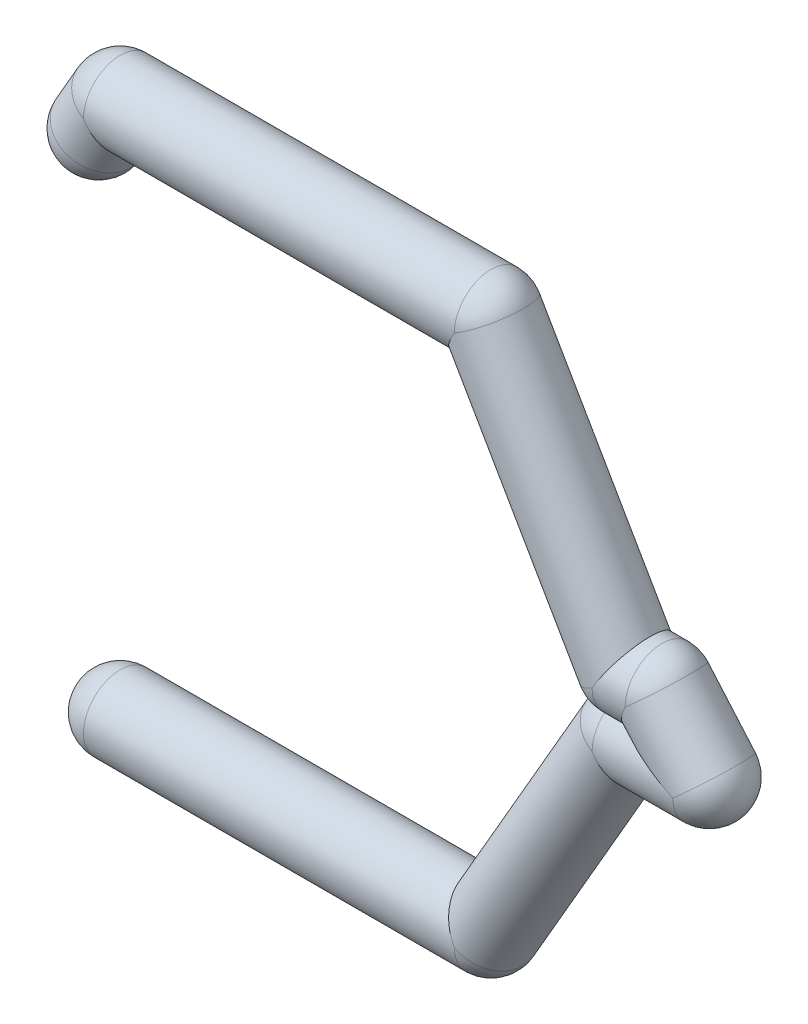
ISO-10303-21;
HEADER;
FILE_DESCRIPTION(('STEP AP214'),'2;1');
FILE_NAME('part.step','',(''),(''),'','','');
FILE_SCHEMA(('AUTOMOTIVE_DESIGN { 1 0 10303 214 1 1 1 1 }'));
ENDSEC;
DATA;
#1=APPLICATION_CONTEXT('core data for automotive mechanical design processes');
#2=APPLICATION_PROTOCOL_DEFINITION('international standard','automotive_design',2000,#1);
#3=PRODUCT_CONTEXT('',#1,'mechanical');
#4=PRODUCT('Part','Part','',(#3));
#5=PRODUCT_RELATED_PRODUCT_CATEGORY('part','',(#4));
#6=PRODUCT_DEFINITION_FORMATION('','',#4);
#7=PRODUCT_DEFINITION_CONTEXT('part definition',#1,'design');
#8=PRODUCT_DEFINITION('design','',#6,#7);
#9=PRODUCT_DEFINITION_SHAPE('','',#8);
#10=(LENGTH_UNIT() NAMED_UNIT(*) SI_UNIT(.MILLI.,.METRE.));
#11=(NAMED_UNIT(*) PLANE_ANGLE_UNIT() SI_UNIT($,.RADIAN.));
#12=(NAMED_UNIT(*) SI_UNIT($,.STERADIAN.) SOLID_ANGLE_UNIT());
#13=UNCERTAINTY_MEASURE_WITH_UNIT(LENGTH_MEASURE(1.E-05),#10,'distance_accuracy_value','');
#14=(GEOMETRIC_REPRESENTATION_CONTEXT(3) GLOBAL_UNCERTAINTY_ASSIGNED_CONTEXT((#13)) GLOBAL_UNIT_ASSIGNED_CONTEXT((#10,
#11,#12)) REPRESENTATION_CONTEXT('',''));
#15=CARTESIAN_POINT('',(0.,0.,0.));
#16=DIRECTION('',(0.,0.,1.));
#17=DIRECTION('',(1.,0.,0.));
#18=AXIS2_PLACEMENT_3D('',#15,#16,#17);
#19=CARTESIAN_POINT('',(-14.515,-1.92,0.825));
#20=DIRECTION('',(1.,0.,0.));
#21=DIRECTION('',(0.,-1.,0.));
#22=AXIS2_PLACEMENT_3D('',#19,#20,#21);
#23=SPHERICAL_SURFACE('',#22,0.24);
#24=CARTESIAN_POINT('',(-14.515,-1.92,0.825));
#25=DIRECTION('',(-1.,0.,0.));
#26=DIRECTION('',(0.,0.,1.));
#27=AXIS2_PLACEMENT_3D('',#24,#25,#26);
#28=CIRCLE('',#27,0.24);
#29=CARTESIAN_POINT('',(-14.515,-1.92,0.585));
#30=VERTEX_POINT('',#29);
#31=CARTESIAN_POINT('',(-14.515,-1.92,1.065));
#32=VERTEX_POINT('',#31);
#33=EDGE_CURVE('E147',#30,#32,#28,.F.);
#34=ORIENTED_EDGE('',*,*,#33,.F.);
#35=CARTESIAN_POINT('',(-14.515,-1.92,0.825));
#36=DIRECTION('',(-0.499207881238382,-0.866482251006612,0.));
#37=DIRECTION('',(0.866482251006612,-0.499207881238382,0.));
#38=AXIS2_PLACEMENT_3D('',#35,#36,#37);
#39=CIRCLE('',#38,0.239999999999999);
#40=EDGE_CURVE('E154',#32,#30,#39,.T.);
#41=ORIENTED_EDGE('',*,*,#40,.F.);
#42=EDGE_LOOP('',(#34,#41));
#43=FACE_BOUND('',#42,.T.);
#44=ADVANCED_FACE('F81',(#43),#23,.T.);
#45=CARTESIAN_POINT('',(-12.09,-1.92,0.825));
#46=DIRECTION('',(-1.,0.,0.));
#47=DIRECTION('',(0.,0.,1.));
#48=AXIS2_PLACEMENT_3D('',#45,#46,#47);
#49=CYLINDRICAL_SURFACE('',#48,0.24);
#50=CARTESIAN_POINT('',(-14.515,-1.92,0.825));
#51=DIRECTION('',(-0.865796708598034,-0.50039590264191,0.));
#52=DIRECTION('',(-0.50039590264191,0.865796708598034,0.));
#53=AXIS2_PLACEMENT_3D('',#50,#51,#52);
#54=ELLIPSE('',#53,0.277201331001392,0.24);
#55=EDGE_CURVE('E94',#30,#32,#54,.T.);
#56=ORIENTED_EDGE('',*,*,#55,.F.);
#57=ORIENTED_EDGE('',*,*,#33,.T.);
#58=EDGE_LOOP('',(#56,#57));
#59=FACE_BOUND('',#58,.T.);
#60=CARTESIAN_POINT('',(-12.09,-1.92,0.825));
#61=DIRECTION('',(-0.866065491045954,0.499930560397472,0.));
#62=DIRECTION('',(-0.499930560397472,-0.866065491045954,0.));
#63=AXIS2_PLACEMENT_3D('',#60,#61,#62);
#64=ELLIPSE('',#63,0.277115301881097,0.24);
#65=CARTESIAN_POINT('',(-12.09,-1.92,1.065));
#66=VERTEX_POINT('',#65);
#67=CARTESIAN_POINT('',(-12.09,-1.92,0.585));
#68=VERTEX_POINT('',#67);
#69=EDGE_CURVE('E88',#66,#68,#64,.F.);
#70=ORIENTED_EDGE('',*,*,#69,.F.);
#71=CARTESIAN_POINT('',(-12.09,-1.92,0.825));
#72=DIRECTION('',(-1.,0.,0.));
#73=DIRECTION('',(0.,0.,1.));
#74=AXIS2_PLACEMENT_3D('',#71,#72,#73);
#75=CIRCLE('',#74,0.24);
#76=EDGE_CURVE('E152',#66,#68,#75,.T.);
#77=ORIENTED_EDGE('',*,*,#76,.T.);
#78=EDGE_LOOP('',(#70,#77));
#79=FACE_BOUND('',#78,.T.);
#80=ADVANCED_FACE('F149',(#59,#79),#49,.T.);
#81=CARTESIAN_POINT('',(-12.09,-1.92,0.825));
#82=DIRECTION('',(1.,0.,0.));
#83=DIRECTION('',(0.,-1.,0.));
#84=AXIS2_PLACEMENT_3D('',#81,#82,#83);
#85=SPHERICAL_SURFACE('',#84,0.24);
#86=ORIENTED_EDGE('',*,*,#76,.F.);
#87=CARTESIAN_POINT('',(-12.09,-1.92,0.825));
#88=DIRECTION('',(-0.500138869561339,0.865945212559032,0.));
#89=DIRECTION('',(-0.865945212559032,-0.500138869561339,0.));
#90=AXIS2_PLACEMENT_3D('',#87,#88,#89);
#91=CIRCLE('',#90,0.24);
#92=EDGE_CURVE('E215',#68,#66,#91,.F.);
#93=ORIENTED_EDGE('',*,*,#92,.F.);
#94=EDGE_LOOP('',(#86,#93));
#95=FACE_BOUND('',#94,.T.);
#96=ADVANCED_FACE('F225',(#95),#85,.T.);
#97=CARTESIAN_POINT('',(-11.189,-3.48,0.825));
#98=DIRECTION('',(-0.500138869561339,0.865945212559032,0.));
#99=DIRECTION('',(-0.865945212559032,-0.500138869561339,0.));
#100=AXIS2_PLACEMENT_3D('',#97,#98,#99);
#101=CYLINDRICAL_SURFACE('',#100,0.240000000000001);
#102=CARTESIAN_POINT('',(-11.189,-3.48,0.825));
#103=DIRECTION('',(-0.866065491045954,0.499930560397472,0.));
#104=DIRECTION('',(0.499930560397472,0.866065491045954,0.));
#105=AXIS2_PLACEMENT_3D('',#102,#103,#104);
#106=ELLIPSE('',#105,0.277115301881097,0.24);
#107=CARTESIAN_POINT('',(-11.189,-3.48,0.585));
#108=VERTEX_POINT('',#107);
#109=CARTESIAN_POINT('',(-11.189,-3.48,1.065));
#110=VERTEX_POINT('',#109);
#111=EDGE_CURVE('E218',#108,#110,#106,.F.);
#112=ORIENTED_EDGE('',*,*,#111,.F.);
#113=CARTESIAN_POINT('',(-11.189,-3.48,0.825));
#114=DIRECTION('',(-0.500138869561337,0.865945212559032,0.));
#115=DIRECTION('',(-0.865945212559032,-0.500138869561337,0.));
#116=AXIS2_PLACEMENT_3D('',#113,#114,#115);
#117=CIRCLE('',#116,0.240000000000001);
#118=EDGE_CURVE('E213',#108,#110,#117,.T.);
#119=ORIENTED_EDGE('',*,*,#118,.T.);
#120=EDGE_LOOP('',(#112,#119));
#121=FACE_BOUND('',#120,.T.);
#122=ORIENTED_EDGE('',*,*,#92,.T.);
#123=ORIENTED_EDGE('',*,*,#69,.T.);
#124=EDGE_LOOP('',(#122,#123));
#125=FACE_BOUND('',#124,.T.);
#126=ADVANCED_FACE('F223',(#121,#125),#101,.T.);
#127=CARTESIAN_POINT('',(-11.189,-3.48,0.825));
#128=DIRECTION('',(1.,0.,0.));
#129=DIRECTION('',(0.,-1.,0.));
#130=AXIS2_PLACEMENT_3D('',#127,#128,#129);
#131=SPHERICAL_SURFACE('',#130,0.24);
#132=ORIENTED_EDGE('',*,*,#118,.F.);
#133=CARTESIAN_POINT('',(-11.189,-3.48,0.825));
#134=DIRECTION('',(-1.,0.,0.));
#135=DIRECTION('',(0.,0.,1.));
#136=AXIS2_PLACEMENT_3D('',#133,#134,#135);
#137=CIRCLE('',#136,0.24);
#138=CARTESIAN_POINT('',(-11.189,-3.66,0.666254921336124));
#139=VERTEX_POINT('',#138);
#140=EDGE_CURVE('E161',#108,#139,#137,.T.);
#141=ORIENTED_EDGE('',*,*,#140,.T.);
#142=CARTESIAN_POINT('',(-11.189,-3.66,0.825));
#143=DIRECTION('',(0.,1.,0.));
#144=DIRECTION('',(0.,0.,1.));
#145=AXIS2_PLACEMENT_3D('',#142,#143,#144);
#146=CIRCLE('',#145,0.158745078663876);
#147=CARTESIAN_POINT('',(-11.189,-3.66,0.983745078663876));
#148=VERTEX_POINT('',#147);
#149=EDGE_CURVE('E187',#139,#148,#146,.T.);
#150=ORIENTED_EDGE('',*,*,#149,.T.);
#151=EDGE_CURVE('E164',#148,#110,#137,.T.);
#152=ORIENTED_EDGE('',*,*,#151,.T.);
#153=EDGE_LOOP('',(#132,#141,#150,#152));
#154=FACE_BOUND('',#153,.T.);
#155=ADVANCED_FACE('F239',(#154),#131,.T.);
#156=CARTESIAN_POINT('',(-10.973,-3.48,0.825));
#157=DIRECTION('',(1.,0.,0.));
#158=DIRECTION('',(0.,-1.,0.));
#159=AXIS2_PLACEMENT_3D('',#156,#157,#158);
#160=SPHERICAL_SURFACE('',#159,0.24);
#161=CARTESIAN_POINT('',(-10.973,-3.48,0.825));
#162=DIRECTION('',(-0.653729317990242,0.756728470985474,0.));
#163=DIRECTION('',(-0.756728470985474,-0.653729317990242,0.));
#164=AXIS2_PLACEMENT_3D('',#161,#162,#163);
#165=CIRCLE('',#164,0.239999999999999);
#166=CARTESIAN_POINT('',(-10.973,-3.48,1.065));
#167=VERTEX_POINT('',#166);
#168=CARTESIAN_POINT('',(-10.973,-3.48,0.585));
#169=VERTEX_POINT('',#168);
#170=EDGE_CURVE('E176',#167,#169,#165,.T.);
#171=ORIENTED_EDGE('',*,*,#170,.T.);
#172=CARTESIAN_POINT('',(-10.973,-3.48,0.825));
#173=DIRECTION('',(-1.,0.,0.));
#174=DIRECTION('',(0.,0.,1.));
#175=AXIS2_PLACEMENT_3D('',#172,#173,#174);
#176=CIRCLE('',#175,0.24);
#177=EDGE_CURVE('E158',#167,#169,#176,.T.);
#178=ORIENTED_EDGE('',*,*,#177,.F.);
#179=EDGE_LOOP('',(#171,#178));
#180=FACE_BOUND('',#179,.T.);
#181=ADVANCED_FACE('F245',(#180),#160,.T.);
#182=CARTESIAN_POINT('',(-10.662,-3.84,0.825));
#183=DIRECTION('',(1.,0.,0.));
#184=DIRECTION('',(0.,-1.,0.));
#185=AXIS2_PLACEMENT_3D('',#182,#183,#184);
#186=SPHERICAL_SURFACE('',#185,0.24);
#187=CARTESIAN_POINT('',(-10.662,-3.84,0.825));
#188=DIRECTION('',(1.,0.,0.));
#189=DIRECTION('',(0.,0.,-1.));
#190=AXIS2_PLACEMENT_3D('',#187,#188,#189);
#191=CIRCLE('',#190,0.24);
#192=CARTESIAN_POINT('',(-10.662,-3.84000000000001,0.585));
#193=VERTEX_POINT('',#192);
#194=CARTESIAN_POINT('',(-10.662,-3.84000000000001,1.065));
#195=VERTEX_POINT('',#194);
#196=EDGE_CURVE('E203',#193,#195,#191,.F.);
#197=ORIENTED_EDGE('',*,*,#196,.F.);
#198=CARTESIAN_POINT('',(-10.662,-3.84,0.825));
#199=DIRECTION('',(-0.653729317990242,0.756728470985474,0.));
#200=DIRECTION('',(-0.756728470985474,-0.653729317990242,0.));
#201=AXIS2_PLACEMENT_3D('',#198,#199,#200);
#202=CIRCLE('',#201,0.239999999999999);
#203=EDGE_CURVE('E173',#195,#193,#202,.T.);
#204=ORIENTED_EDGE('',*,*,#203,.F.);
#205=EDGE_LOOP('',(#197,#204));
#206=FACE_BOUND('',#205,.T.);
#207=ADVANCED_FACE('F241',(#206),#186,.T.);
#208=CARTESIAN_POINT('',(-11.189,-3.84,0.825));
#209=DIRECTION('',(1.,0.,0.));
#210=DIRECTION('',(0.,0.,-1.));
#211=AXIS2_PLACEMENT_3D('',#208,#209,#210);
#212=CYLINDRICAL_SURFACE('',#211,0.24);
#213=DIRECTION('',(-1.,0.,0.));
#214=VECTOR('',#213,1.);
#215=CARTESIAN_POINT('',(-11.081,-3.66,0.983745078663876));
#216=LINE('',#215,#214);
#217=CARTESIAN_POINT('',(-11.0553660337249,-3.66,0.983745078663875));
#218=VERTEX_POINT('',#217);
#219=EDGE_CURVE('E167',#148,#218,#216,.F.);
#220=ORIENTED_EDGE('',*,*,#219,.F.);
#221=CARTESIAN_POINT('',(-11.189,-3.84,0.825));
#222=DIRECTION('',(1.,0.,0.));
#223=DIRECTION('',(0.,0.,-1.));
#224=AXIS2_PLACEMENT_3D('',#221,#222,#223);
#225=CIRCLE('',#224,0.24);
#226=CARTESIAN_POINT('',(-11.189,-3.84,1.065));
#227=VERTEX_POINT('',#226);
#228=EDGE_CURVE('E199',#148,#227,#225,.T.);
#229=ORIENTED_EDGE('',*,*,#228,.T.);
#230=CARTESIAN_POINT('',(-11.189,-3.84,0.825));
#231=DIRECTION('',(0.866065491045954,0.499930560397472,0.));
#232=DIRECTION('',(0.499930560397472,-0.866065491045954,0.));
#233=AXIS2_PLACEMENT_3D('',#230,#231,#232);
#234=ELLIPSE('',#233,0.277115301881097,0.24);
#235=CARTESIAN_POINT('',(-11.189,-3.84,0.585));
#236=VERTEX_POINT('',#235);
#237=EDGE_CURVE('E206',#236,#227,#234,.F.);
#238=ORIENTED_EDGE('',*,*,#237,.F.);
#239=EDGE_CURVE('E200',#236,#139,#225,.T.);
#240=ORIENTED_EDGE('',*,*,#239,.T.);
#241=DIRECTION('',(-1.,0.,0.));
#242=VECTOR('',#241,1.);
#243=CARTESIAN_POINT('',(-11.081,-3.66,0.666254921336124));
#244=LINE('',#243,#242);
#245=CARTESIAN_POINT('',(-11.0553660337249,-3.66,0.666254921336126));
#246=VERTEX_POINT('',#245);
#247=EDGE_CURVE('E170',#246,#139,#244,.T.);
#248=ORIENTED_EDGE('',*,*,#247,.F.);
#249=CARTESIAN_POINT('',(-10.662,-3.84,0.825));
#250=DIRECTION('',(0.416095350857088,0.909320987877832,0.));
#251=DIRECTION('',(0.909320987877832,-0.416095350857088,0.));
#252=AXIS2_PLACEMENT_3D('',#249,#250,#251);
#253=ELLIPSE('',#252,0.576790871384741,0.24);
#254=EDGE_CURVE('E181',#193,#246,#253,.T.);
#255=ORIENTED_EDGE('',*,*,#254,.F.);
#256=ORIENTED_EDGE('',*,*,#196,.T.);
#257=EDGE_CURVE('E179',#218,#195,#253,.T.);
#258=ORIENTED_EDGE('',*,*,#257,.F.);
#259=EDGE_LOOP('',(#220,#229,#238,#240,#248,#255,#256,#258));
#260=FACE_BOUND('',#259,.T.);
#261=ADVANCED_FACE('F244',(#260),#212,.T.);
#262=CARTESIAN_POINT('',(-11.189,-3.84,0.825));
#263=DIRECTION('',(1.,0.,0.));
#264=DIRECTION('',(0.,-1.,0.));
#265=AXIS2_PLACEMENT_3D('',#262,#263,#264);
#266=SPHERICAL_SURFACE('',#265,0.24);
#267=ORIENTED_EDGE('',*,*,#239,.F.);
#268=CARTESIAN_POINT('',(-11.189,-3.84,0.825));
#269=DIRECTION('',(0.500138869561338,0.865945212559032,0.));
#270=DIRECTION('',(-0.865945212559032,0.500138869561338,0.));
#271=AXIS2_PLACEMENT_3D('',#268,#269,#270);
#272=CIRCLE('',#271,0.24);
#273=EDGE_CURVE('E193',#227,#236,#272,.F.);
#274=ORIENTED_EDGE('',*,*,#273,.F.);
#275=ORIENTED_EDGE('',*,*,#228,.F.);
#276=ORIENTED_EDGE('',*,*,#149,.F.);
#277=EDGE_LOOP('',(#267,#274,#275,#276));
#278=FACE_BOUND('',#277,.T.);
#279=ADVANCED_FACE('F249',(#278),#266,.T.);
#280=CARTESIAN_POINT('',(-12.09,-5.4,0.825));
#281=DIRECTION('',(0.500138869561338,0.865945212559032,0.));
#282=DIRECTION('',(-0.865945212559032,0.500138869561338,0.));
#283=AXIS2_PLACEMENT_3D('',#280,#281,#282);
#284=CYLINDRICAL_SURFACE('',#283,0.240000000000001);
#285=CARTESIAN_POINT('',(-12.09,-5.4,0.825));
#286=DIRECTION('',(0.866065491045954,0.499930560397472,0.));
#287=DIRECTION('',(-0.499930560397472,0.866065491045954,0.));
#288=AXIS2_PLACEMENT_3D('',#285,#286,#287);
#289=ELLIPSE('',#288,0.277115301881097,0.24);
#290=CARTESIAN_POINT('',(-12.09,-5.4,1.065));
#291=VERTEX_POINT('',#290);
#292=CARTESIAN_POINT('',(-12.09,-5.4,0.584999999999999));
#293=VERTEX_POINT('',#292);
#294=EDGE_CURVE('E196',#291,#293,#289,.F.);
#295=ORIENTED_EDGE('',*,*,#294,.F.);
#296=CARTESIAN_POINT('',(-12.09,-5.4,0.825));
#297=DIRECTION('',(0.500138869561338,0.865945212559032,0.));
#298=DIRECTION('',(-0.865945212559032,0.500138869561338,0.));
#299=AXIS2_PLACEMENT_3D('',#296,#297,#298);
#300=CIRCLE('',#299,0.240000000000001);
#301=EDGE_CURVE('E190',#291,#293,#300,.T.);
#302=ORIENTED_EDGE('',*,*,#301,.T.);
#303=EDGE_LOOP('',(#295,#302));
#304=FACE_BOUND('',#303,.T.);
#305=ORIENTED_EDGE('',*,*,#273,.T.);
#306=ORIENTED_EDGE('',*,*,#237,.T.);
#307=EDGE_LOOP('',(#305,#306));
#308=FACE_BOUND('',#307,.T.);
#309=ADVANCED_FACE('F253',(#304,#308),#284,.T.);
#310=CARTESIAN_POINT('',(-12.09,-5.4,0.825));
#311=DIRECTION('',(1.,0.,0.));
#312=DIRECTION('',(0.,-1.,0.));
#313=AXIS2_PLACEMENT_3D('',#310,#311,#312);
#314=SPHERICAL_SURFACE('',#313,0.24);
#315=ORIENTED_EDGE('',*,*,#301,.F.);
#316=CARTESIAN_POINT('',(-12.09,-5.4,0.825));
#317=DIRECTION('',(1.,0.,0.));
#318=DIRECTION('',(0.,0.,-1.));
#319=AXIS2_PLACEMENT_3D('',#316,#317,#318);
#320=CIRCLE('',#319,0.24);
#321=EDGE_CURVE('E185',#291,#293,#320,.T.);
#322=ORIENTED_EDGE('',*,*,#321,.T.);
#323=EDGE_LOOP('',(#315,#322));
#324=FACE_BOUND('',#323,.T.);
#325=ADVANCED_FACE('F257',(#324),#314,.T.);
#326=CARTESIAN_POINT('',(-14.515,-5.4,0.825));
#327=DIRECTION('',(1.,0.,0.));
#328=DIRECTION('',(0.,0.,-1.));
#329=AXIS2_PLACEMENT_3D('',#326,#327,#328);
#330=CYLINDRICAL_SURFACE('',#329,0.24);
#331=ORIENTED_EDGE('',*,*,#321,.F.);
#332=ORIENTED_EDGE('',*,*,#294,.T.);
#333=EDGE_LOOP('',(#331,#332));
#334=FACE_BOUND('',#333,.T.);
#335=CARTESIAN_POINT('',(-14.515,-5.4,0.825));
#336=DIRECTION('',(1.,0.,0.));
#337=DIRECTION('',(0.,0.,-1.));
#338=AXIS2_PLACEMENT_3D('',#335,#336,#337);
#339=CIRCLE('',#338,0.24);
#340=CARTESIAN_POINT('',(-14.515,-5.4,0.585));
#341=VERTEX_POINT('',#340);
#342=EDGE_CURVE('E182',#341,#341,#339,.T.);
#343=ORIENTED_EDGE('',*,*,#342,.T.);
#344=EDGE_LOOP('',(#343));
#345=FACE_BOUND('',#344,.T.);
#346=ADVANCED_FACE('F269',(#334,#345),#330,.T.);
#347=CARTESIAN_POINT('',(-14.515,-5.4,0.825));
#348=DIRECTION('',(1.,0.,0.));
#349=DIRECTION('',(0.,-1.,0.));
#350=AXIS2_PLACEMENT_3D('',#347,#348,#349);
#351=SPHERICAL_SURFACE('',#350,0.24);
#352=ORIENTED_EDGE('',*,*,#342,.F.);
#353=EDGE_LOOP('',(#352));
#354=FACE_BOUND('',#353,.T.);
#355=ADVANCED_FACE('F265',(#354),#351,.T.);
#356=CARTESIAN_POINT('',(-10.662,-3.84,0.825));
#357=DIRECTION('',(-0.653729317990233,0.756728470985481,0.));
#358=DIRECTION('',(-0.756728470985481,-0.653729317990233,0.));
#359=AXIS2_PLACEMENT_3D('',#356,#357,#358);
#360=CYLINDRICAL_SURFACE('',#359,0.239999999999999);
#361=CARTESIAN_POINT('',(-10.973,-3.48,0.825));
#362=DIRECTION('',(-0.909320987877832,0.416095350857088,0.));
#363=DIRECTION('',(0.416095350857088,0.909320987877832,0.));
#364=AXIS2_PLACEMENT_3D('',#361,#362,#363);
#365=ELLIPSE('',#364,0.263933202025954,0.24);
#366=EDGE_CURVE('E212',#169,#246,#365,.T.);
#367=ORIENTED_EDGE('',*,*,#366,.F.);
#368=ORIENTED_EDGE('',*,*,#170,.F.);
#369=EDGE_CURVE('E209',#218,#167,#365,.T.);
#370=ORIENTED_EDGE('',*,*,#369,.F.);
#371=ORIENTED_EDGE('',*,*,#257,.T.);
#372=ORIENTED_EDGE('',*,*,#203,.T.);
#373=ORIENTED_EDGE('',*,*,#254,.T.);
#374=EDGE_LOOP('',(#367,#368,#370,#371,#372,#373));
#375=FACE_BOUND('',#374,.T.);
#376=ADVANCED_FACE('F268',(#375),#360,.T.);
#377=CARTESIAN_POINT('',(-10.973,-3.48,0.825));
#378=DIRECTION('',(-1.,0.,0.));
#379=DIRECTION('',(0.,0.,1.));
#380=AXIS2_PLACEMENT_3D('',#377,#378,#379);
#381=CYLINDRICAL_SURFACE('',#380,0.24);
#382=ORIENTED_EDGE('',*,*,#140,.F.);
#383=ORIENTED_EDGE('',*,*,#111,.T.);
#384=ORIENTED_EDGE('',*,*,#151,.F.);
#385=ORIENTED_EDGE('',*,*,#219,.T.);
#386=ORIENTED_EDGE('',*,*,#369,.T.);
#387=ORIENTED_EDGE('',*,*,#177,.T.);
#388=ORIENTED_EDGE('',*,*,#366,.T.);
#389=ORIENTED_EDGE('',*,*,#247,.T.);
#390=EDGE_LOOP('',(#382,#383,#384,#385,#386,#387,#388,#389));
#391=FACE_BOUND('',#390,.T.);
#392=ADVANCED_FACE('F279',(#391),#381,.T.);
#393=CARTESIAN_POINT('',(-14.515,-1.92,0.825));
#394=DIRECTION('',(-0.499207881238377,-0.866482251006615,0.));
#395=DIRECTION('',(0.866482251006615,-0.499207881238377,0.));
#396=AXIS2_PLACEMENT_3D('',#393,#394,#395);
#397=CYLINDRICAL_SURFACE('',#396,0.239999999999999);
#398=CARTESIAN_POINT('',(-14.655,-2.163,0.825));
#399=DIRECTION('',(-0.499207881238377,-0.866482251006615,0.));
#400=DIRECTION('',(0.866482251006615,-0.499207881238377,0.));
#401=AXIS2_PLACEMENT_3D('',#398,#399,#400);
#402=CIRCLE('',#401,0.24);
#403=CARTESIAN_POINT('',(-14.4470442597584,-2.28280989149721,0.825));
#404=VERTEX_POINT('',#403);
#405=EDGE_CURVE('E12',#404,#404,#402,.F.);
#406=ORIENTED_EDGE('',*,*,#405,.T.);
#407=EDGE_LOOP('',(#406));
#408=FACE_BOUND('',#407,.T.);
#409=ORIENTED_EDGE('',*,*,#40,.T.);
#410=ORIENTED_EDGE('',*,*,#55,.T.);
#411=EDGE_LOOP('',(#409,#410));
#412=FACE_BOUND('',#411,.T.);
#413=ADVANCED_FACE('F157',(#408,#412),#397,.T.);
#414=CARTESIAN_POINT('',(-14.655,-2.163,0.825));
#415=DIRECTION('',(1.,0.,0.));
#416=DIRECTION('',(0.,-1.,0.));
#417=AXIS2_PLACEMENT_3D('',#414,#415,#416);
#418=SPHERICAL_SURFACE('',#417,0.24);
#419=CARTESIAN_POINT('',(-14.655,-2.163,0.825));
#420=DIRECTION('',(-0.499207881238377,-0.866482251006615,0.));
#421=DIRECTION('',(0.866482251006615,-0.499207881238377,0.));
#422=AXIS2_PLACEMENT_3D('',#419,#420,#421);
#423=SPHERICAL_SURFACE('',#422,0.24);
#424=ORIENTED_EDGE('',*,*,#405,.F.);
#425=EDGE_LOOP('',(#424));
#426=FACE_BOUND('',#425,.T.);
#427=ADVANCED_FACE('F233',(#426),#423,.T.);
#428=CLOSED_SHELL('',(#44,#80,#96,#126,#155,#181,#207,#261,#279,#309,#325,#346,#355,#376,#392,
#413,#427));
#429=MANIFOLD_SOLID_BREP('B2',#428);
#430=ADVANCED_BREP_SHAPE_REPRESENTATION('',(#18,#429),#14);
#431=SHAPE_DEFINITION_REPRESENTATION(#9,#430);
ENDSEC;
END-ISO-10303-21;
